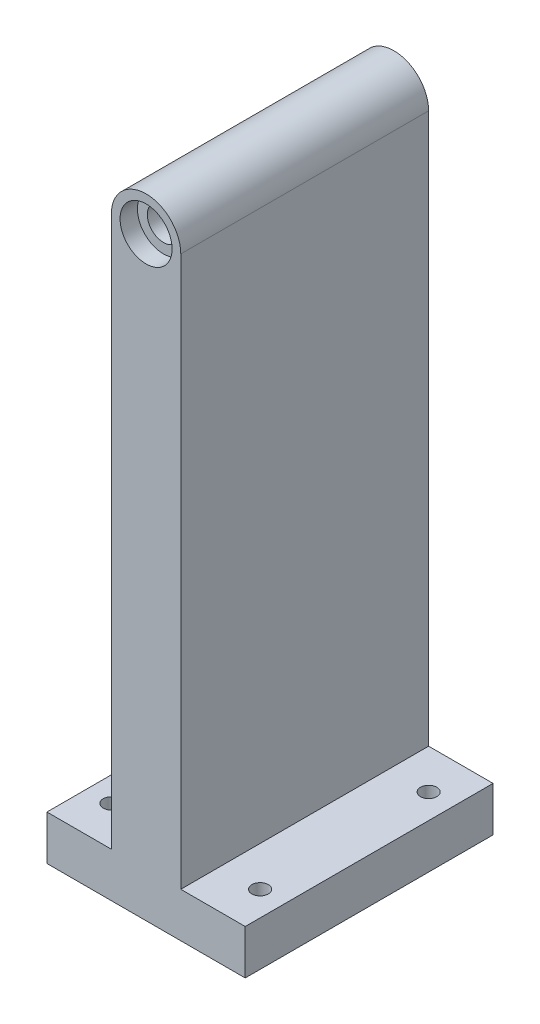
ISO-10303-21;
HEADER;
FILE_DESCRIPTION(('STEP AP214'),'2;1');
FILE_NAME('part.step','',(''),(''),'','','');
FILE_SCHEMA(('AUTOMOTIVE_DESIGN { 1 0 10303 214 1 1 1 1 }'));
ENDSEC;
DATA;
#1=APPLICATION_CONTEXT('core data for automotive mechanical design processes');
#2=APPLICATION_PROTOCOL_DEFINITION('international standard','automotive_design',2000,#1);
#3=PRODUCT_CONTEXT('',#1,'mechanical');
#4=PRODUCT('Part','Part','',(#3));
#5=PRODUCT_RELATED_PRODUCT_CATEGORY('part','',(#4));
#6=PRODUCT_DEFINITION_FORMATION('','',#4);
#7=PRODUCT_DEFINITION_CONTEXT('part definition',#1,'design');
#8=PRODUCT_DEFINITION('design','',#6,#7);
#9=PRODUCT_DEFINITION_SHAPE('','',#8);
#10=(LENGTH_UNIT() NAMED_UNIT(*) SI_UNIT(.MILLI.,.METRE.));
#11=(NAMED_UNIT(*) PLANE_ANGLE_UNIT() SI_UNIT($,.RADIAN.));
#12=(NAMED_UNIT(*) SI_UNIT($,.STERADIAN.) SOLID_ANGLE_UNIT());
#13=UNCERTAINTY_MEASURE_WITH_UNIT(LENGTH_MEASURE(1.E-05),#10,'distance_accuracy_value','');
#14=(GEOMETRIC_REPRESENTATION_CONTEXT(3) GLOBAL_UNCERTAINTY_ASSIGNED_CONTEXT((#13)) GLOBAL_UNIT_ASSIGNED_CONTEXT((#10,
#11,#12)) REPRESENTATION_CONTEXT('',''));
#15=CARTESIAN_POINT('',(0.,0.,0.));
#16=DIRECTION('',(0.,0.,1.));
#17=DIRECTION('',(1.,0.,0.));
#18=AXIS2_PLACEMENT_3D('',#15,#16,#17);
#19=CARTESIAN_POINT('',(88.5079571493369,125.,-14.6197090989965));
#20=DIRECTION('',(0.,0.,1.));
#21=DIRECTION('',(1.,0.,0.));
#22=AXIS2_PLACEMENT_3D('',#19,#20,#21);
#23=CYLINDRICAL_SURFACE('',#22,3.25000000000001);
#24=CARTESIAN_POINT('',(88.5079571493369,125.,46.729533305921));
#25=DIRECTION('',(0.,0.,1.));
#26=DIRECTION('',(1.,0.,0.));
#27=AXIS2_PLACEMENT_3D('',#24,#25,#26);
#28=CIRCLE('',#27,3.25000000000001);
#29=CARTESIAN_POINT('',(91.7579571493369,125.,46.729533305921));
#30=VERTEX_POINT('',#29);
#31=EDGE_CURVE('E201',#30,#30,#28,.T.);
#32=ORIENTED_EDGE('',*,*,#31,.T.);
#33=EDGE_LOOP('',(#32));
#34=FACE_BOUND('',#33,.T.);
#35=CARTESIAN_POINT('',(88.5079571493369,125.,3.72953330592103));
#36=DIRECTION('',(0.,0.,-1.));
#37=DIRECTION('',(-1.,0.,0.));
#38=AXIS2_PLACEMENT_3D('',#35,#36,#37);
#39=CIRCLE('',#38,3.25000000000001);
#40=CARTESIAN_POINT('',(85.2579571493369,125.,3.72953330592103));
#41=VERTEX_POINT('',#40);
#42=EDGE_CURVE('E172',#41,#41,#39,.T.);
#43=ORIENTED_EDGE('',*,*,#42,.T.);
#44=EDGE_LOOP('',(#43));
#45=FACE_BOUND('',#44,.T.);
#46=ADVANCED_FACE('F56',(#34,#45),#23,.F.);
#47=CARTESIAN_POINT('',(95.5079571493369,0.,40.229533305921));
#48=DIRECTION('',(-1.,0.,0.));
#49=DIRECTION('',(0.,-1.,0.));
#50=AXIS2_PLACEMENT_3D('',#47,#48,#49);
#51=PLANE('',#50);
#52=DIRECTION('',(0.,-1.,0.));
#53=VECTOR('',#52,1.);
#54=CARTESIAN_POINT('',(95.5079571493369,0.,50.229533305921));
#55=LINE('',#54,#53);
#56=CARTESIAN_POINT('',(95.5079571493368,125.,50.229533305921));
#57=VERTEX_POINT('',#56);
#58=CARTESIAN_POINT('',(95.5079571493369,14.,50.229533305921));
#59=VERTEX_POINT('',#58);
#60=EDGE_CURVE('E168',#57,#59,#55,.T.);
#61=ORIENTED_EDGE('',*,*,#60,.T.);
#62=DIRECTION('',(0.,0.,1.));
#63=VECTOR('',#62,1.);
#64=CARTESIAN_POINT('',(95.5079571493369,14.,40.229533305921));
#65=LINE('',#64,#63);
#66=CARTESIAN_POINT('',(95.5079571493369,14.,0.229533305921029));
#67=VERTEX_POINT('',#66);
#68=EDGE_CURVE('E124',#67,#59,#65,.T.);
#69=ORIENTED_EDGE('',*,*,#68,.F.);
#70=DIRECTION('',(0.,-1.,0.));
#71=VECTOR('',#70,1.);
#72=CARTESIAN_POINT('',(95.5079571493369,0.,0.229533305921029));
#73=LINE('',#72,#71);
#74=CARTESIAN_POINT('',(95.5079571493368,125.,0.229533305921029));
#75=VERTEX_POINT('',#74);
#76=EDGE_CURVE('E194',#75,#67,#73,.T.);
#77=ORIENTED_EDGE('',*,*,#76,.F.);
#78=DIRECTION('',(0.,0.,1.));
#79=VECTOR('',#78,1.);
#80=CARTESIAN_POINT('',(95.5079571493368,125.,40.229533305921));
#81=LINE('',#80,#79);
#82=EDGE_CURVE('E171',#75,#57,#81,.T.);
#83=ORIENTED_EDGE('',*,*,#82,.T.);
#84=EDGE_LOOP('',(#61,#69,#77,#83));
#85=FACE_BOUND('',#84,.T.);
#86=ADVANCED_FACE('F280',(#85),#51,.F.);
#87=CARTESIAN_POINT('',(0.,14.,40.229533305921));
#88=DIRECTION('',(0.,1.,0.));
#89=DIRECTION('',(0.,0.,1.));
#90=AXIS2_PLACEMENT_3D('',#87,#88,#89);
#91=PLANE('',#90);
#92=CARTESIAN_POINT('',(103.507957149337,14.,8.22953330592102));
#93=DIRECTION('',(0.,1.,0.));
#94=DIRECTION('',(0.,0.,1.));
#95=AXIS2_PLACEMENT_3D('',#92,#93,#94);
#96=CIRCLE('',#95,1.64999999999998);
#97=CARTESIAN_POINT('',(103.507957149337,14.,9.87953330592101));
#98=VERTEX_POINT('',#97);
#99=EDGE_CURVE('E229',#98,#98,#96,.T.);
#100=ORIENTED_EDGE('',*,*,#99,.F.);
#101=EDGE_LOOP('',(#100));
#102=FACE_BOUND('',#101,.T.);
#103=CARTESIAN_POINT('',(103.507957149337,14.,42.2295333059211));
#104=DIRECTION('',(0.,1.,0.));
#105=DIRECTION('',(0.,0.,1.));
#106=AXIS2_PLACEMENT_3D('',#103,#104,#105);
#107=CIRCLE('',#106,1.64999999999998);
#108=CARTESIAN_POINT('',(103.507957149337,14.,43.879533305921));
#109=VERTEX_POINT('',#108);
#110=EDGE_CURVE('E225',#109,#109,#107,.T.);
#111=ORIENTED_EDGE('',*,*,#110,.F.);
#112=EDGE_LOOP('',(#111));
#113=FACE_BOUND('',#112,.T.);
#114=DIRECTION('',(-1.,0.,0.));
#115=VECTOR('',#114,1.);
#116=CARTESIAN_POINT('',(0.,14.,50.229533305921));
#117=LINE('',#116,#115);
#118=CARTESIAN_POINT('',(108.507957149337,14.,50.229533305921));
#119=VERTEX_POINT('',#118);
#120=EDGE_CURVE('E151',#119,#59,#117,.T.);
#121=ORIENTED_EDGE('',*,*,#120,.F.);
#122=DIRECTION('',(0.,0.,1.));
#123=VECTOR('',#122,1.);
#124=CARTESIAN_POINT('',(108.507957149337,14.,40.229533305921));
#125=LINE('',#124,#123);
#126=CARTESIAN_POINT('',(108.507957149337,14.,0.229533305921029));
#127=VERTEX_POINT('',#126);
#128=EDGE_CURVE('E119',#127,#119,#125,.T.);
#129=ORIENTED_EDGE('',*,*,#128,.F.);
#130=DIRECTION('',(-1.,0.,0.));
#131=VECTOR('',#130,1.);
#132=CARTESIAN_POINT('',(0.,14.,0.229533305921029));
#133=LINE('',#132,#131);
#134=EDGE_CURVE('E195',#127,#67,#133,.T.);
#135=ORIENTED_EDGE('',*,*,#134,.T.);
#136=ORIENTED_EDGE('',*,*,#68,.T.);
#137=EDGE_LOOP('',(#121,#129,#135,#136));
#138=FACE_BOUND('',#137,.T.);
#139=ADVANCED_FACE('F286',(#102,#113,#138),#91,.T.);
#140=CARTESIAN_POINT('',(108.507957149337,0.,40.229533305921));
#141=DIRECTION('',(-1.,0.,0.));
#142=DIRECTION('',(0.,0.,1.));
#143=AXIS2_PLACEMENT_3D('',#140,#141,#142);
#144=PLANE('',#143);
#145=DIRECTION('',(0.,-1.,0.));
#146=VECTOR('',#145,1.);
#147=CARTESIAN_POINT('',(108.507957149337,0.,50.229533305921));
#148=LINE('',#147,#146);
#149=CARTESIAN_POINT('',(108.507957149337,5.,50.229533305921));
#150=VERTEX_POINT('',#149);
#151=EDGE_CURVE('E329',#119,#150,#148,.T.);
#152=ORIENTED_EDGE('',*,*,#151,.T.);
#153=DIRECTION('',(0.,0.,1.));
#154=VECTOR('',#153,1.);
#155=CARTESIAN_POINT('',(108.507957149337,5.,40.229533305921));
#156=LINE('',#155,#154);
#157=CARTESIAN_POINT('',(108.507957149337,5.,0.229533305921029));
#158=VERTEX_POINT('',#157);
#159=EDGE_CURVE('E12',#158,#150,#156,.T.);
#160=ORIENTED_EDGE('',*,*,#159,.F.);
#161=DIRECTION('',(0.,-1.,0.));
#162=VECTOR('',#161,1.);
#163=CARTESIAN_POINT('',(108.507957149337,0.,0.229533305921029));
#164=LINE('',#163,#162);
#165=EDGE_CURVE('E190',#127,#158,#164,.T.);
#166=ORIENTED_EDGE('',*,*,#165,.F.);
#167=ORIENTED_EDGE('',*,*,#128,.T.);
#168=EDGE_LOOP('',(#152,#160,#166,#167));
#169=FACE_BOUND('',#168,.T.);
#170=ADVANCED_FACE('F276',(#169),#144,.F.);
#171=CARTESIAN_POINT('',(68.5079571493369,0.,40.229533305921));
#172=DIRECTION('',(-1.,0.,0.));
#173=DIRECTION('',(0.,0.,1.));
#174=AXIS2_PLACEMENT_3D('',#171,#172,#173);
#175=PLANE('',#174);
#176=DIRECTION('',(0.,-1.,0.));
#177=VECTOR('',#176,1.);
#178=CARTESIAN_POINT('',(68.5079571493369,0.,50.229533305921));
#179=LINE('',#178,#177);
#180=CARTESIAN_POINT('',(68.5079571493369,14.,50.229533305921));
#181=VERTEX_POINT('',#180);
#182=CARTESIAN_POINT('',(68.5079571493369,5.,50.229533305921));
#183=VERTEX_POINT('',#182);
#184=EDGE_CURVE('E146',#181,#183,#179,.T.);
#185=ORIENTED_EDGE('',*,*,#184,.F.);
#186=DIRECTION('',(0.,0.,1.));
#187=VECTOR('',#186,1.);
#188=CARTESIAN_POINT('',(68.5079571493369,14.,40.229533305921));
#189=LINE('',#188,#187);
#190=CARTESIAN_POINT('',(68.5079571493369,14.,0.229533305921029));
#191=VERTEX_POINT('',#190);
#192=EDGE_CURVE('E131',#191,#181,#189,.T.);
#193=ORIENTED_EDGE('',*,*,#192,.F.);
#194=DIRECTION('',(0.,-1.,0.));
#195=VECTOR('',#194,1.);
#196=CARTESIAN_POINT('',(68.5079571493369,0.,0.229533305921029));
#197=LINE('',#196,#195);
#198=CARTESIAN_POINT('',(68.5079571493369,5.,0.229533305921029));
#199=VERTEX_POINT('',#198);
#200=EDGE_CURVE('E182',#191,#199,#197,.T.);
#201=ORIENTED_EDGE('',*,*,#200,.T.);
#202=DIRECTION('',(0.,0.,1.));
#203=VECTOR('',#202,1.);
#204=CARTESIAN_POINT('',(68.5079571493369,5.,40.229533305921));
#205=LINE('',#204,#203);
#206=EDGE_CURVE('E148',#199,#183,#205,.T.);
#207=ORIENTED_EDGE('',*,*,#206,.T.);
#208=EDGE_LOOP('',(#185,#193,#201,#207));
#209=FACE_BOUND('',#208,.T.);
#210=ADVANCED_FACE('F147',(#209),#175,.T.);
#211=CARTESIAN_POINT('',(0.,14.,40.229533305921));
#212=DIRECTION('',(0.,1.,0.));
#213=DIRECTION('',(-1.,0.,0.));
#214=AXIS2_PLACEMENT_3D('',#211,#212,#213);
#215=PLANE('',#214);
#216=CARTESIAN_POINT('',(73.5079571493369,14.,8.22953330592103));
#217=DIRECTION('',(0.,1.,0.));
#218=DIRECTION('',(0.,0.,1.));
#219=AXIS2_PLACEMENT_3D('',#216,#217,#218);
#220=CIRCLE('',#219,1.64999999999998);
#221=CARTESIAN_POINT('',(73.5079571493369,14.,9.87953330592101));
#222=VERTEX_POINT('',#221);
#223=EDGE_CURVE('E234',#222,#222,#220,.T.);
#224=ORIENTED_EDGE('',*,*,#223,.F.);
#225=EDGE_LOOP('',(#224));
#226=FACE_BOUND('',#225,.T.);
#227=CARTESIAN_POINT('',(73.5079571493369,14.,42.229533305921));
#228=DIRECTION('',(0.,1.,0.));
#229=DIRECTION('',(0.,0.,1.));
#230=AXIS2_PLACEMENT_3D('',#227,#228,#229);
#231=CIRCLE('',#230,1.64999999999998);
#232=CARTESIAN_POINT('',(73.5079571493369,14.,43.879533305921));
#233=VERTEX_POINT('',#232);
#234=EDGE_CURVE('E220',#233,#233,#231,.T.);
#235=ORIENTED_EDGE('',*,*,#234,.F.);
#236=EDGE_LOOP('',(#235));
#237=FACE_BOUND('',#236,.T.);
#238=DIRECTION('',(-1.,0.,0.));
#239=VECTOR('',#238,1.);
#240=CARTESIAN_POINT('',(0.,14.,50.229533305921));
#241=LINE('',#240,#239);
#242=CARTESIAN_POINT('',(81.5079571493369,14.,50.229533305921));
#243=VERTEX_POINT('',#242);
#244=EDGE_CURVE('E135',#243,#181,#241,.T.);
#245=ORIENTED_EDGE('',*,*,#244,.F.);
#246=DIRECTION('',(0.,0.,1.));
#247=VECTOR('',#246,1.);
#248=CARTESIAN_POINT('',(81.5079571493369,14.,40.229533305921));
#249=LINE('',#248,#247);
#250=CARTESIAN_POINT('',(81.5079571493369,14.,0.229533305921029));
#251=VERTEX_POINT('',#250);
#252=EDGE_CURVE('E176',#251,#243,#249,.T.);
#253=ORIENTED_EDGE('',*,*,#252,.F.);
#254=DIRECTION('',(-1.,0.,0.));
#255=VECTOR('',#254,1.);
#256=CARTESIAN_POINT('',(0.,14.,0.229533305921029));
#257=LINE('',#256,#255);
#258=EDGE_CURVE('E138',#251,#191,#257,.T.);
#259=ORIENTED_EDGE('',*,*,#258,.T.);
#260=ORIENTED_EDGE('',*,*,#192,.T.);
#261=EDGE_LOOP('',(#245,#253,#259,#260));
#262=FACE_BOUND('',#261,.T.);
#263=ADVANCED_FACE('F133',(#226,#237,#262),#215,.T.);
#264=CARTESIAN_POINT('',(81.5079571493369,0.,40.229533305921));
#265=DIRECTION('',(-1.,0.,0.));
#266=DIRECTION('',(0.,-1.,0.));
#267=AXIS2_PLACEMENT_3D('',#264,#265,#266);
#268=PLANE('',#267);
#269=DIRECTION('',(0.,-1.,0.));
#270=VECTOR('',#269,1.);
#271=CARTESIAN_POINT('',(81.5079571493369,0.,50.229533305921));
#272=LINE('',#271,#270);
#273=CARTESIAN_POINT('',(81.5079571493369,125.,50.229533305921));
#274=VERTEX_POINT('',#273);
#275=EDGE_CURVE('E157',#274,#243,#272,.T.);
#276=ORIENTED_EDGE('',*,*,#275,.F.);
#277=DIRECTION('',(0.,0.,1.));
#278=VECTOR('',#277,1.);
#279=CARTESIAN_POINT('',(81.5079571493369,125.,40.229533305921));
#280=LINE('',#279,#278);
#281=CARTESIAN_POINT('',(81.5079571493369,125.,0.229533305921029));
#282=VERTEX_POINT('',#281);
#283=EDGE_CURVE('E92',#282,#274,#280,.T.);
#284=ORIENTED_EDGE('',*,*,#283,.F.);
#285=DIRECTION('',(0.,-1.,0.));
#286=VECTOR('',#285,1.);
#287=CARTESIAN_POINT('',(81.5079571493369,0.,0.229533305921029));
#288=LINE('',#287,#286);
#289=EDGE_CURVE('E143',#282,#251,#288,.T.);
#290=ORIENTED_EDGE('',*,*,#289,.T.);
#291=ORIENTED_EDGE('',*,*,#252,.T.);
#292=EDGE_LOOP('',(#276,#284,#290,#291));
#293=FACE_BOUND('',#292,.T.);
#294=ADVANCED_FACE('F266',(#293),#268,.T.);
#295=CARTESIAN_POINT('',(88.5079571493369,125.,40.229533305921));
#296=DIRECTION('',(0.,0.,1.));
#297=DIRECTION('',(1.,0.,0.));
#298=AXIS2_PLACEMENT_3D('',#295,#296,#297);
#299=CYLINDRICAL_SURFACE('',#298,7.);
#300=CARTESIAN_POINT('',(88.5079571493369,125.,50.229533305921));
#301=DIRECTION('',(0.,0.,1.));
#302=DIRECTION('',(1.,0.,0.));
#303=AXIS2_PLACEMENT_3D('',#300,#301,#302);
#304=CIRCLE('',#303,7.);
#305=EDGE_CURVE('E161',#57,#274,#304,.T.);
#306=ORIENTED_EDGE('',*,*,#305,.F.);
#307=ORIENTED_EDGE('',*,*,#82,.F.);
#308=CARTESIAN_POINT('',(88.5079571493369,125.,0.229533305921029));
#309=DIRECTION('',(0.,0.,1.));
#310=DIRECTION('',(1.,0.,0.));
#311=AXIS2_PLACEMENT_3D('',#308,#309,#310);
#312=CIRCLE('',#311,7.);
#313=EDGE_CURVE('E173',#75,#282,#312,.T.);
#314=ORIENTED_EDGE('',*,*,#313,.T.);
#315=ORIENTED_EDGE('',*,*,#283,.T.);
#316=EDGE_LOOP('',(#306,#307,#314,#315));
#317=FACE_BOUND('',#316,.T.);
#318=ADVANCED_FACE('F273',(#317),#299,.T.);
#319=CARTESIAN_POINT('',(88.5079571493369,125.,40.229533305921));
#320=DIRECTION('',(0.,0.,1.));
#321=DIRECTION('',(1.,0.,0.));
#322=AXIS2_PLACEMENT_3D('',#319,#320,#321);
#323=CYLINDRICAL_SURFACE('',#322,5.25);
#324=CARTESIAN_POINT('',(88.5079571493369,125.,46.729533305921));
#325=DIRECTION('',(0.,0.,1.));
#326=DIRECTION('',(1.,0.,0.));
#327=AXIS2_PLACEMENT_3D('',#324,#325,#326);
#328=CIRCLE('',#327,5.25);
#329=CARTESIAN_POINT('',(93.7579571493369,125.,46.729533305921));
#330=VERTEX_POINT('',#329);
#331=EDGE_CURVE('E189',#330,#330,#328,.T.);
#332=ORIENTED_EDGE('',*,*,#331,.F.);
#333=EDGE_LOOP('',(#332));
#334=FACE_BOUND('',#333,.T.);
#335=CARTESIAN_POINT('',(88.5079571493369,125.,50.229533305921));
#336=DIRECTION('',(0.,0.,1.));
#337=DIRECTION('',(1.,0.,0.));
#338=AXIS2_PLACEMENT_3D('',#335,#336,#337);
#339=CIRCLE('',#338,5.25);
#340=CARTESIAN_POINT('',(93.7579571493369,125.,50.229533305921));
#341=VERTEX_POINT('',#340);
#342=EDGE_CURVE('E167',#341,#341,#339,.T.);
#343=ORIENTED_EDGE('',*,*,#342,.T.);
#344=EDGE_LOOP('',(#343));
#345=FACE_BOUND('',#344,.T.);
#346=ADVANCED_FACE('F353',(#334,#345),#323,.F.);
#347=CARTESIAN_POINT('',(0.,0.,50.229533305921));
#348=DIRECTION('',(0.,0.,1.));
#349=DIRECTION('',(1.,0.,0.));
#350=AXIS2_PLACEMENT_3D('',#347,#348,#349);
#351=PLANE('',#350);
#352=ORIENTED_EDGE('',*,*,#60,.F.);
#353=ORIENTED_EDGE('',*,*,#305,.T.);
#354=ORIENTED_EDGE('',*,*,#275,.T.);
#355=ORIENTED_EDGE('',*,*,#244,.T.);
#356=ORIENTED_EDGE('',*,*,#184,.T.);
#357=DIRECTION('',(-1.,0.,0.));
#358=VECTOR('',#357,1.);
#359=CARTESIAN_POINT('',(0.,5.,50.229533305921));
#360=LINE('',#359,#358);
#361=EDGE_CURVE('E67',#150,#183,#360,.T.);
#362=ORIENTED_EDGE('',*,*,#361,.F.);
#363=ORIENTED_EDGE('',*,*,#151,.F.);
#364=ORIENTED_EDGE('',*,*,#120,.T.);
#365=EDGE_LOOP('',(#352,#353,#354,#355,#356,#362,#363,#364));
#366=FACE_BOUND('',#365,.T.);
#367=ORIENTED_EDGE('',*,*,#342,.F.);
#368=EDGE_LOOP('',(#367));
#369=FACE_BOUND('',#368,.T.);
#370=ADVANCED_FACE('F154',(#366,#369),#351,.T.);
#371=CARTESIAN_POINT('',(0.,0.,0.229533305921029));
#372=DIRECTION('',(0.,0.,-1.));
#373=DIRECTION('',(1.,0.,0.));
#374=AXIS2_PLACEMENT_3D('',#371,#372,#373);
#375=PLANE('',#374);
#376=CARTESIAN_POINT('',(88.5079571493369,125.,0.229533305921029));
#377=DIRECTION('',(0.,0.,-1.));
#378=DIRECTION('',(-1.,0.,0.));
#379=AXIS2_PLACEMENT_3D('',#376,#377,#378);
#380=CIRCLE('',#379,5.25);
#381=CARTESIAN_POINT('',(83.2579571493369,125.,0.229533305921029));
#382=VERTEX_POINT('',#381);
#383=EDGE_CURVE('E208',#382,#382,#380,.T.);
#384=ORIENTED_EDGE('',*,*,#383,.F.);
#385=EDGE_LOOP('',(#384));
#386=FACE_BOUND('',#385,.T.);
#387=ORIENTED_EDGE('',*,*,#76,.T.);
#388=ORIENTED_EDGE('',*,*,#134,.F.);
#389=ORIENTED_EDGE('',*,*,#165,.T.);
#390=DIRECTION('',(-1.,0.,0.));
#391=VECTOR('',#390,1.);
#392=CARTESIAN_POINT('',(0.,5.,0.229533305921029));
#393=LINE('',#392,#391);
#394=EDGE_CURVE('E185',#158,#199,#393,.T.);
#395=ORIENTED_EDGE('',*,*,#394,.T.);
#396=ORIENTED_EDGE('',*,*,#200,.F.);
#397=ORIENTED_EDGE('',*,*,#258,.F.);
#398=ORIENTED_EDGE('',*,*,#289,.F.);
#399=ORIENTED_EDGE('',*,*,#313,.F.);
#400=EDGE_LOOP('',(#387,#388,#389,#395,#396,#397,#398,#399));
#401=FACE_BOUND('',#400,.T.);
#402=ADVANCED_FACE('F292',(#386,#401),#375,.T.);
#403=CARTESIAN_POINT('',(88.5079571493369,125.,46.729533305921));
#404=DIRECTION('',(0.,0.,1.));
#405=DIRECTION('',(1.,0.,0.));
#406=AXIS2_PLACEMENT_3D('',#403,#404,#405);
#407=PLANE('',#406);
#408=ORIENTED_EDGE('',*,*,#31,.F.);
#409=EDGE_LOOP('',(#408));
#410=FACE_BOUND('',#409,.T.);
#411=ORIENTED_EDGE('',*,*,#331,.T.);
#412=EDGE_LOOP('',(#411));
#413=FACE_BOUND('',#412,.T.);
#414=ADVANCED_FACE('F294',(#410,#413),#407,.T.);
#415=CARTESIAN_POINT('',(88.5079571493369,125.,3.72953330592103));
#416=DIRECTION('',(0.,0.,-1.));
#417=DIRECTION('',(-1.,0.,0.));
#418=AXIS2_PLACEMENT_3D('',#415,#416,#417);
#419=CYLINDRICAL_SURFACE('',#418,5.25);
#420=CARTESIAN_POINT('',(88.5079571493369,125.,3.72953330592103));
#421=DIRECTION('',(0.,0.,-1.));
#422=DIRECTION('',(-1.,0.,0.));
#423=AXIS2_PLACEMENT_3D('',#420,#421,#422);
#424=CIRCLE('',#423,5.25);
#425=CARTESIAN_POINT('',(83.2579571493369,125.,3.72953330592103));
#426=VERTEX_POINT('',#425);
#427=EDGE_CURVE('E212',#426,#426,#424,.T.);
#428=ORIENTED_EDGE('',*,*,#427,.F.);
#429=EDGE_LOOP('',(#428));
#430=FACE_BOUND('',#429,.T.);
#431=ORIENTED_EDGE('',*,*,#383,.T.);
#432=EDGE_LOOP('',(#431));
#433=FACE_BOUND('',#432,.T.);
#434=ADVANCED_FACE('F297',(#430,#433),#419,.F.);
#435=CARTESIAN_POINT('',(88.5079571493369,125.,3.72953330592103));
#436=DIRECTION('',(0.,0.,-1.));
#437=DIRECTION('',(-1.,0.,0.));
#438=AXIS2_PLACEMENT_3D('',#435,#436,#437);
#439=PLANE('',#438);
#440=ORIENTED_EDGE('',*,*,#42,.F.);
#441=EDGE_LOOP('',(#440));
#442=FACE_BOUND('',#441,.T.);
#443=ORIENTED_EDGE('',*,*,#427,.T.);
#444=EDGE_LOOP('',(#443));
#445=FACE_BOUND('',#444,.T.);
#446=ADVANCED_FACE('F261',(#442,#445),#439,.T.);
#447=CARTESIAN_POINT('',(73.5079571493369,14.,42.229533305921));
#448=DIRECTION('',(0.,1.,0.));
#449=DIRECTION('',(0.,0.,1.));
#450=AXIS2_PLACEMENT_3D('',#447,#448,#449);
#451=CYLINDRICAL_SURFACE('',#450,1.64999999999999);
#452=CARTESIAN_POINT('',(73.5079571493369,5.,42.229533305921));
#453=DIRECTION('',(0.,1.,0.));
#454=DIRECTION('',(0.,0.,1.));
#455=AXIS2_PLACEMENT_3D('',#452,#453,#454);
#456=CIRCLE('',#455,1.64999999999999);
#457=CARTESIAN_POINT('',(73.5079571493369,5.,43.879533305921));
#458=VERTEX_POINT('',#457);
#459=EDGE_CURVE('E216',#458,#458,#456,.F.);
#460=ORIENTED_EDGE('',*,*,#459,.T.);
#461=EDGE_LOOP('',(#460));
#462=FACE_BOUND('',#461,.T.);
#463=ORIENTED_EDGE('',*,*,#234,.T.);
#464=EDGE_LOOP('',(#463));
#465=FACE_BOUND('',#464,.T.);
#466=ADVANCED_FACE('F258',(#462,#465),#451,.F.);
#467=CARTESIAN_POINT('',(103.507957149337,14.,42.2295333059211));
#468=DIRECTION('',(0.,1.,0.));
#469=DIRECTION('',(0.,0.,1.));
#470=AXIS2_PLACEMENT_3D('',#467,#468,#469);
#471=CYLINDRICAL_SURFACE('',#470,1.64999999999999);
#472=CARTESIAN_POINT('',(103.507957149337,5.,42.2295333059211));
#473=DIRECTION('',(0.,1.,0.));
#474=DIRECTION('',(0.,0.,1.));
#475=AXIS2_PLACEMENT_3D('',#472,#473,#474);
#476=CIRCLE('',#475,1.64999999999999);
#477=CARTESIAN_POINT('',(103.507957149337,5.,43.879533305921));
#478=VERTEX_POINT('',#477);
#479=EDGE_CURVE('E224',#478,#478,#476,.F.);
#480=ORIENTED_EDGE('',*,*,#479,.T.);
#481=EDGE_LOOP('',(#480));
#482=FACE_BOUND('',#481,.T.);
#483=ORIENTED_EDGE('',*,*,#110,.T.);
#484=EDGE_LOOP('',(#483));
#485=FACE_BOUND('',#484,.T.);
#486=ADVANCED_FACE('F244',(#482,#485),#471,.F.);
#487=CARTESIAN_POINT('',(103.507957149337,14.,8.22953330592102));
#488=DIRECTION('',(0.,1.,0.));
#489=DIRECTION('',(0.,0.,1.));
#490=AXIS2_PLACEMENT_3D('',#487,#488,#489);
#491=CYLINDRICAL_SURFACE('',#490,1.64999999999999);
#492=CARTESIAN_POINT('',(103.507957149337,5.,8.22953330592102));
#493=DIRECTION('',(0.,1.,0.));
#494=DIRECTION('',(0.,0.,1.));
#495=AXIS2_PLACEMENT_3D('',#492,#493,#494);
#496=CIRCLE('',#495,1.64999999999999);
#497=CARTESIAN_POINT('',(103.507957149337,5.,9.87953330592101));
#498=VERTEX_POINT('',#497);
#499=EDGE_CURVE('E60',#498,#498,#496,.F.);
#500=ORIENTED_EDGE('',*,*,#499,.T.);
#501=EDGE_LOOP('',(#500));
#502=FACE_BOUND('',#501,.T.);
#503=ORIENTED_EDGE('',*,*,#99,.T.);
#504=EDGE_LOOP('',(#503));
#505=FACE_BOUND('',#504,.T.);
#506=ADVANCED_FACE('F307',(#502,#505),#491,.F.);
#507=CARTESIAN_POINT('',(73.5079571493369,14.,8.22953330592103));
#508=DIRECTION('',(0.,1.,0.));
#509=DIRECTION('',(0.,0.,1.));
#510=AXIS2_PLACEMENT_3D('',#507,#508,#509);
#511=CYLINDRICAL_SURFACE('',#510,1.64999999999999);
#512=CARTESIAN_POINT('',(73.5079571493369,5.,8.22953330592103));
#513=DIRECTION('',(0.,1.,0.));
#514=DIRECTION('',(0.,0.,1.));
#515=AXIS2_PLACEMENT_3D('',#512,#513,#514);
#516=CIRCLE('',#515,1.64999999999999);
#517=CARTESIAN_POINT('',(73.5079571493369,5.,9.87953330592102));
#518=VERTEX_POINT('',#517);
#519=EDGE_CURVE('E233',#518,#518,#516,.F.);
#520=ORIENTED_EDGE('',*,*,#519,.T.);
#521=EDGE_LOOP('',(#520));
#522=FACE_BOUND('',#521,.T.);
#523=ORIENTED_EDGE('',*,*,#223,.T.);
#524=EDGE_LOOP('',(#523));
#525=FACE_BOUND('',#524,.T.);
#526=ADVANCED_FACE('F249',(#522,#525),#511,.F.);
#527=CARTESIAN_POINT('',(313.507957149337,5.,-74.770466694079));
#528=DIRECTION('',(0.,1.,0.));
#529=DIRECTION('',(0.,0.,1.));
#530=AXIS2_PLACEMENT_3D('',#527,#528,#529);
#531=PLANE('',#530);
#532=ORIENTED_EDGE('',*,*,#361,.T.);
#533=ORIENTED_EDGE('',*,*,#206,.F.);
#534=ORIENTED_EDGE('',*,*,#394,.F.);
#535=ORIENTED_EDGE('',*,*,#159,.T.);
#536=EDGE_LOOP('',(#532,#533,#534,#535));
#537=FACE_BOUND('',#536,.T.);
#538=ORIENTED_EDGE('',*,*,#479,.F.);
#539=EDGE_LOOP('',(#538));
#540=FACE_BOUND('',#539,.T.);
#541=ORIENTED_EDGE('',*,*,#519,.F.);
#542=EDGE_LOOP('',(#541));
#543=FACE_BOUND('',#542,.T.);
#544=ORIENTED_EDGE('',*,*,#499,.F.);
#545=EDGE_LOOP('',(#544));
#546=FACE_BOUND('',#545,.T.);
#547=ORIENTED_EDGE('',*,*,#459,.F.);
#548=EDGE_LOOP('',(#547));
#549=FACE_BOUND('',#548,.T.);
#550=ADVANCED_FACE('F58',(#537,#540,#543,#546,#549),#531,.F.);
#551=CLOSED_SHELL('',(#46,#86,#139,#170,#210,#263,#294,#318,#346,#370,#402,#414,#434,#446,#466,
#486,#506,#526,#550));
#552=MANIFOLD_SOLID_BREP('B2',#551);
#553=ADVANCED_BREP_SHAPE_REPRESENTATION('',(#18,#552),#14);
#554=SHAPE_DEFINITION_REPRESENTATION(#9,#553);
ENDSEC;
END-ISO-10303-21;
